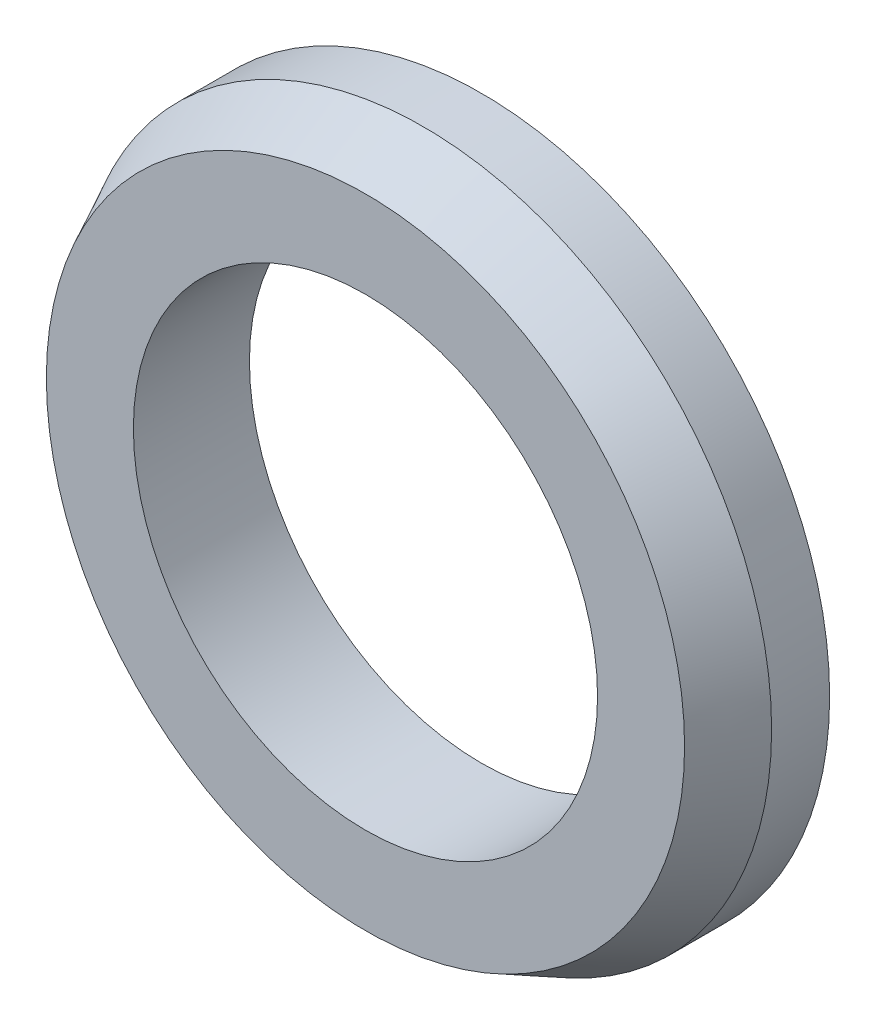
ISO-10303-21;
HEADER;
FILE_DESCRIPTION(('STEP AP214'),'2;1');
FILE_NAME('part.step','',(''),(''),'','','');
FILE_SCHEMA(('AUTOMOTIVE_DESIGN { 1 0 10303 214 1 1 1 1 }'));
ENDSEC;
DATA;
#1=APPLICATION_CONTEXT('core data for automotive mechanical design processes');
#2=APPLICATION_PROTOCOL_DEFINITION('international standard','automotive_design',2000,#1);
#3=PRODUCT_CONTEXT('',#1,'mechanical');
#4=PRODUCT('Part','Part','',(#3));
#5=PRODUCT_RELATED_PRODUCT_CATEGORY('part','',(#4));
#6=PRODUCT_DEFINITION_FORMATION('','',#4);
#7=PRODUCT_DEFINITION_CONTEXT('part definition',#1,'design');
#8=PRODUCT_DEFINITION('design','',#6,#7);
#9=PRODUCT_DEFINITION_SHAPE('','',#8);
#10=(LENGTH_UNIT() NAMED_UNIT(*) SI_UNIT(.MILLI.,.METRE.));
#11=(NAMED_UNIT(*) PLANE_ANGLE_UNIT() SI_UNIT($,.RADIAN.));
#12=(NAMED_UNIT(*) SI_UNIT($,.STERADIAN.) SOLID_ANGLE_UNIT());
#13=UNCERTAINTY_MEASURE_WITH_UNIT(LENGTH_MEASURE(1.E-05),#10,'distance_accuracy_value','');
#14=(GEOMETRIC_REPRESENTATION_CONTEXT(3) GLOBAL_UNCERTAINTY_ASSIGNED_CONTEXT((#13)) GLOBAL_UNIT_ASSIGNED_CONTEXT((#10,
#11,#12)) REPRESENTATION_CONTEXT('',''));
#15=CARTESIAN_POINT('',(0.,0.,0.));
#16=DIRECTION('',(0.,0.,1.));
#17=DIRECTION('',(1.,0.,0.));
#18=AXIS2_PLACEMENT_3D('',#15,#16,#17);
#19=CARTESIAN_POINT('',(0.,0.,0.));
#20=DIRECTION('',(0.,0.,-1.));
#21=DIRECTION('',(-1.,0.,0.));
#22=AXIS2_PLACEMENT_3D('',#19,#20,#21);
#23=CYLINDRICAL_SURFACE('',#22,4.);
#24=CARTESIAN_POINT('',(0.,0.,0.));
#25=DIRECTION('',(0.,0.,-1.));
#26=DIRECTION('',(-1.,0.,0.));
#27=AXIS2_PLACEMENT_3D('',#24,#25,#26);
#28=CIRCLE('',#27,4.);
#29=CARTESIAN_POINT('',(-4.,0.,0.));
#30=VERTEX_POINT('',#29);
#31=EDGE_CURVE('E10',#30,#30,#28,.T.);
#32=ORIENTED_EDGE('',*,*,#31,.T.);
#33=EDGE_LOOP('',(#32));
#34=FACE_BOUND('',#33,.T.);
#35=CARTESIAN_POINT('',(0.,0.,2.));
#36=DIRECTION('',(0.,0.,-1.));
#37=DIRECTION('',(-1.,0.,0.));
#38=AXIS2_PLACEMENT_3D('',#35,#36,#37);
#39=CIRCLE('',#38,4.);
#40=CARTESIAN_POINT('',(-4.,0.,2.));
#41=VERTEX_POINT('',#40);
#42=EDGE_CURVE('E49',#41,#41,#39,.T.);
#43=ORIENTED_EDGE('',*,*,#42,.F.);
#44=EDGE_LOOP('',(#43));
#45=FACE_BOUND('',#44,.T.);
#46=ADVANCED_FACE('F30',(#34,#45),#23,.F.);
#47=CARTESIAN_POINT('',(0.,4.,0.));
#48=DIRECTION('',(0.,0.,-1.));
#49=DIRECTION('',(-1.,0.,0.));
#50=AXIS2_PLACEMENT_3D('',#47,#48,#49);
#51=PLANE('',#50);
#52=CARTESIAN_POINT('',(0.,0.,0.));
#53=DIRECTION('',(0.,0.,-1.));
#54=DIRECTION('',(-1.,0.,0.));
#55=AXIS2_PLACEMENT_3D('',#52,#53,#54);
#56=CIRCLE('',#55,6.);
#57=CARTESIAN_POINT('',(-6.,0.,0.));
#58=VERTEX_POINT('',#57);
#59=EDGE_CURVE('E36',#58,#58,#56,.T.);
#60=ORIENTED_EDGE('',*,*,#59,.T.);
#61=EDGE_LOOP('',(#60));
#62=FACE_BOUND('',#61,.T.);
#63=ORIENTED_EDGE('',*,*,#31,.F.);
#64=EDGE_LOOP('',(#63));
#65=FACE_BOUND('',#64,.T.);
#66=ADVANCED_FACE('F57',(#62,#65),#51,.T.);
#67=CARTESIAN_POINT('',(0.,0.,0.));
#68=DIRECTION('',(0.,0.,-1.));
#69=DIRECTION('',(-1.,0.,0.));
#70=AXIS2_PLACEMENT_3D('',#67,#68,#69);
#71=CYLINDRICAL_SURFACE('',#70,6.);
#72=CARTESIAN_POINT('',(0.,0.,1.));
#73=DIRECTION('',(0.,0.,-1.));
#74=DIRECTION('',(-1.,0.,0.));
#75=AXIS2_PLACEMENT_3D('',#72,#73,#74);
#76=CIRCLE('',#75,6.);
#77=CARTESIAN_POINT('',(-6.,0.,1.));
#78=VERTEX_POINT('',#77);
#79=EDGE_CURVE('E40',#78,#78,#76,.T.);
#80=ORIENTED_EDGE('',*,*,#79,.T.);
#81=EDGE_LOOP('',(#80));
#82=FACE_BOUND('',#81,.T.);
#83=ORIENTED_EDGE('',*,*,#59,.F.);
#84=EDGE_LOOP('',(#83));
#85=FACE_BOUND('',#84,.T.);
#86=ADVANCED_FACE('F61',(#82,#85),#71,.T.);
#87=CARTESIAN_POINT('',(0.,0.,1.));
#88=DIRECTION('',(0.,0.,-1.));
#89=DIRECTION('',(-1.,0.,0.));
#90=AXIS2_PLACEMENT_3D('',#87,#88,#89);
#91=CONICAL_SURFACE('',#90,6.,0.463647609000807);
#92=CARTESIAN_POINT('',(0.,0.,2.));
#93=DIRECTION('',(0.,0.,-1.));
#94=DIRECTION('',(-1.,0.,0.));
#95=AXIS2_PLACEMENT_3D('',#92,#93,#94);
#96=CIRCLE('',#95,5.5);
#97=CARTESIAN_POINT('',(-5.5,0.,2.));
#98=VERTEX_POINT('',#97);
#99=EDGE_CURVE('E44',#98,#98,#96,.T.);
#100=ORIENTED_EDGE('',*,*,#99,.T.);
#101=EDGE_LOOP('',(#100));
#102=FACE_BOUND('',#101,.T.);
#103=ORIENTED_EDGE('',*,*,#79,.F.);
#104=EDGE_LOOP('',(#103));
#105=FACE_BOUND('',#104,.T.);
#106=ADVANCED_FACE('F65',(#102,#105),#91,.T.);
#107=CARTESIAN_POINT('',(0.,5.5,2.));
#108=DIRECTION('',(0.,0.,1.));
#109=DIRECTION('',(1.,0.,0.));
#110=AXIS2_PLACEMENT_3D('',#107,#108,#109);
#111=PLANE('',#110);
#112=ORIENTED_EDGE('',*,*,#42,.T.);
#113=EDGE_LOOP('',(#112));
#114=FACE_BOUND('',#113,.T.);
#115=ORIENTED_EDGE('',*,*,#99,.F.);
#116=EDGE_LOOP('',(#115));
#117=FACE_BOUND('',#116,.T.);
#118=ADVANCED_FACE('F53',(#114,#117),#111,.T.);
#119=CLOSED_SHELL('',(#46,#66,#86,#106,#118));
#120=MANIFOLD_SOLID_BREP('B2',#119);
#121=ADVANCED_BREP_SHAPE_REPRESENTATION('',(#18,#120),#14);
#122=SHAPE_DEFINITION_REPRESENTATION(#9,#121);
ENDSEC;
END-ISO-10303-21;
